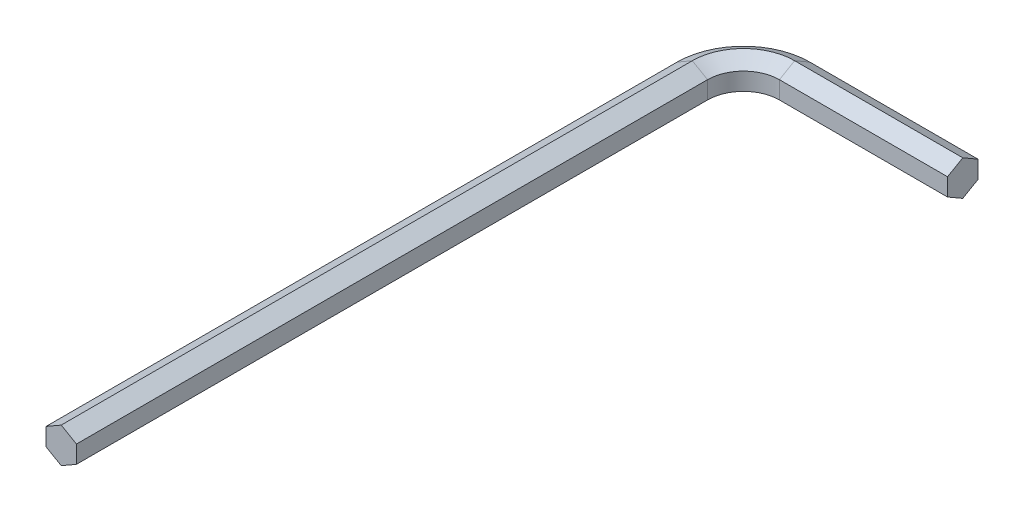
ISO-10303-21;
HEADER;
FILE_DESCRIPTION(('STEP AP214'),'2;1');
FILE_NAME('part.step','',(''),(''),'','','');
FILE_SCHEMA(('AUTOMOTIVE_DESIGN { 1 0 10303 214 1 1 1 1 }'));
ENDSEC;
DATA;
#1=APPLICATION_CONTEXT('core data for automotive mechanical design processes');
#2=APPLICATION_PROTOCOL_DEFINITION('international standard','automotive_design',2000,#1);
#3=PRODUCT_CONTEXT('',#1,'mechanical');
#4=PRODUCT('Part','Part','',(#3));
#5=PRODUCT_RELATED_PRODUCT_CATEGORY('part','',(#4));
#6=PRODUCT_DEFINITION_FORMATION('','',#4);
#7=PRODUCT_DEFINITION_CONTEXT('part definition',#1,'design');
#8=PRODUCT_DEFINITION('design','',#6,#7);
#9=PRODUCT_DEFINITION_SHAPE('','',#8);
#10=(LENGTH_UNIT() NAMED_UNIT(*) SI_UNIT(.MILLI.,.METRE.));
#11=(NAMED_UNIT(*) PLANE_ANGLE_UNIT() SI_UNIT($,.RADIAN.));
#12=(NAMED_UNIT(*) SI_UNIT($,.STERADIAN.) SOLID_ANGLE_UNIT());
#13=UNCERTAINTY_MEASURE_WITH_UNIT(LENGTH_MEASURE(1.E-05),#10,'distance_accuracy_value','');
#14=(GEOMETRIC_REPRESENTATION_CONTEXT(3) GLOBAL_UNCERTAINTY_ASSIGNED_CONTEXT((#13)) GLOBAL_UNIT_ASSIGNED_CONTEXT((#10,
#11,#12)) REPRESENTATION_CONTEXT('',''));
#15=CARTESIAN_POINT('',(0.,0.,0.));
#16=DIRECTION('',(0.,0.,1.));
#17=DIRECTION('',(1.,0.,0.));
#18=AXIS2_PLACEMENT_3D('',#15,#16,#17);
#19=CARTESIAN_POINT('',(0.,0.,0.));
#20=DIRECTION('',(0.,0.,1.));
#21=DIRECTION('',(1.,0.,0.));
#22=AXIS2_PLACEMENT_3D('',#19,#20,#21);
#23=PLANE('',#22);
#24=DIRECTION('',(0.866025403784441,-0.499999999999995,0.));
#25=VECTOR('',#24,1.);
#26=CARTESIAN_POINT('',(-1.24999999999999,-0.721687836487043,0.));
#27=LINE('',#26,#25);
#28=CARTESIAN_POINT('',(-1.24999999999999,-0.721687836487043,0.));
#29=VERTEX_POINT('',#28);
#30=CARTESIAN_POINT('',(0.,-1.44337567297406,0.));
#31=VERTEX_POINT('',#30);
#32=EDGE_CURVE('E188',#29,#31,#27,.T.);
#33=ORIENTED_EDGE('',*,*,#32,.T.);
#34=DIRECTION('',(0.866025403784438,0.500000000000001,0.));
#35=VECTOR('',#34,1.);
#36=CARTESIAN_POINT('',(0.,-1.44337567297406,0.));
#37=LINE('',#36,#35);
#38=CARTESIAN_POINT('',(1.25,-0.721687836487026,0.));
#39=VERTEX_POINT('',#38);
#40=EDGE_CURVE('E147',#31,#39,#37,.T.);
#41=ORIENTED_EDGE('',*,*,#40,.T.);
#42=DIRECTION('',(0.,1.,0.));
#43=VECTOR('',#42,1.);
#44=CARTESIAN_POINT('',(1.25,-0.721687836487026,0.));
#45=LINE('',#44,#43);
#46=CARTESIAN_POINT('',(1.24999999999999,0.721687836487034,0.));
#47=VERTEX_POINT('',#46);
#48=EDGE_CURVE('E139',#39,#47,#45,.T.);
#49=ORIENTED_EDGE('',*,*,#48,.T.);
#50=DIRECTION('',(-0.866025403784441,0.499999999999995,0.));
#51=VECTOR('',#50,1.);
#52=CARTESIAN_POINT('',(1.24999999999999,0.721687836487034,0.));
#53=LINE('',#52,#51);
#54=CARTESIAN_POINT('',(0.,1.44337567297406,0.));
#55=VERTEX_POINT('',#54);
#56=EDGE_CURVE('E132',#47,#55,#53,.T.);
#57=ORIENTED_EDGE('',*,*,#56,.T.);
#58=DIRECTION('',(-0.866025403784435,-0.500000000000007,0.));
#59=VECTOR('',#58,1.);
#60=CARTESIAN_POINT('',(0.,1.44337567297406,0.));
#61=LINE('',#60,#59);
#62=CARTESIAN_POINT('',(-1.25,0.721687836487017,0.));
#63=VERTEX_POINT('',#62);
#64=EDGE_CURVE('E213',#55,#63,#61,.T.);
#65=ORIENTED_EDGE('',*,*,#64,.T.);
#66=DIRECTION('',(0.,-1.,0.));
#67=VECTOR('',#66,1.);
#68=CARTESIAN_POINT('',(-1.25,0.721687836487017,0.));
#69=LINE('',#68,#67);
#70=EDGE_CURVE('E227',#63,#29,#69,.T.);
#71=ORIENTED_EDGE('',*,*,#70,.T.);
#72=EDGE_LOOP('',(#33,#41,#49,#57,#65,#71));
#73=FACE_BOUND('',#72,.T.);
#74=ADVANCED_FACE('F33',(#73),#23,.T.);
#75=CARTESIAN_POINT('',(18.,0.,-56.));
#76=DIRECTION('',(-1.,0.,0.));
#77=DIRECTION('',(0.,0.,1.));
#78=AXIS2_PLACEMENT_3D('',#75,#76,#77);
#79=PLANE('',#78);
#80=DIRECTION('',(0.,-0.499999999999995,0.866025403784441));
#81=VECTOR('',#80,1.);
#82=CARTESIAN_POINT('',(18.,-0.721687836487043,-57.25));
#83=LINE('',#82,#81);
#84=CARTESIAN_POINT('',(18.,-0.721687836487043,-57.25));
#85=VERTEX_POINT('',#84);
#86=CARTESIAN_POINT('',(18.,-1.44337567297406,-56.));
#87=VERTEX_POINT('',#86);
#88=EDGE_CURVE('E161',#85,#87,#83,.T.);
#89=ORIENTED_EDGE('',*,*,#88,.F.);
#90=DIRECTION('',(0.,-1.,0.));
#91=VECTOR('',#90,1.);
#92=CARTESIAN_POINT('',(18.,0.721687836487017,-57.25));
#93=LINE('',#92,#91);
#94=CARTESIAN_POINT('',(18.,0.721687836487017,-57.25));
#95=VERTEX_POINT('',#94);
#96=EDGE_CURVE('E11',#95,#85,#93,.T.);
#97=ORIENTED_EDGE('',*,*,#96,.F.);
#98=DIRECTION('',(0.,-0.500000000000007,-0.866025403784435));
#99=VECTOR('',#98,1.);
#100=CARTESIAN_POINT('',(18.,1.44337567297406,-56.));
#101=LINE('',#100,#99);
#102=CARTESIAN_POINT('',(18.,1.44337567297406,-56.));
#103=VERTEX_POINT('',#102);
#104=EDGE_CURVE('E47',#103,#95,#101,.T.);
#105=ORIENTED_EDGE('',*,*,#104,.F.);
#106=DIRECTION('',(0.,0.499999999999995,-0.866025403784441));
#107=VECTOR('',#106,1.);
#108=CARTESIAN_POINT('',(18.,0.721687836487034,-54.75));
#109=LINE('',#108,#107);
#110=CARTESIAN_POINT('',(18.,0.721687836487034,-54.75));
#111=VERTEX_POINT('',#110);
#112=EDGE_CURVE('E56',#111,#103,#109,.T.);
#113=ORIENTED_EDGE('',*,*,#112,.F.);
#114=DIRECTION('',(0.,1.,0.));
#115=VECTOR('',#114,1.);
#116=CARTESIAN_POINT('',(18.,-0.721687836487026,-54.75));
#117=LINE('',#116,#115);
#118=CARTESIAN_POINT('',(18.,-0.721687836487026,-54.75));
#119=VERTEX_POINT('',#118);
#120=EDGE_CURVE('E174',#119,#111,#117,.T.);
#121=ORIENTED_EDGE('',*,*,#120,.F.);
#122=DIRECTION('',(0.,0.500000000000001,0.866025403784438));
#123=VECTOR('',#122,1.);
#124=CARTESIAN_POINT('',(18.,-1.44337567297406,-56.));
#125=LINE('',#124,#123);
#126=EDGE_CURVE('E172',#87,#119,#125,.T.);
#127=ORIENTED_EDGE('',*,*,#126,.F.);
#128=EDGE_LOOP('',(#89,#97,#105,#113,#121,#127));
#129=FACE_BOUND('',#128,.T.);
#130=ADVANCED_FACE('F173',(#129),#79,.F.);
#131=CARTESIAN_POINT('',(-1.24999999999999,-0.721687836487043,0.));
#132=DIRECTION('',(0.499999999999995,0.866025403784441,0.));
#133=DIRECTION('',(-0.866025403784441,0.499999999999995,0.));
#134=AXIS2_PLACEMENT_3D('',#131,#132,#133);
#135=PLANE('',#134);
#136=DIRECTION('',(0.,0.,-1.));
#137=VECTOR('',#136,1.);
#138=CARTESIAN_POINT('',(0.,-1.44337567297406,0.));
#139=LINE('',#138,#137);
#140=CARTESIAN_POINT('',(0.,-1.44337567297406,-51.8));
#141=VERTEX_POINT('',#140);
#142=EDGE_CURVE('E193',#31,#141,#139,.T.);
#143=ORIENTED_EDGE('',*,*,#142,.F.);
#144=ORIENTED_EDGE('',*,*,#32,.F.);
#145=DIRECTION('',(0.,0.,-1.));
#146=VECTOR('',#145,1.);
#147=CARTESIAN_POINT('',(-1.24999999999999,-0.721687836487043,0.));
#148=LINE('',#147,#146);
#149=CARTESIAN_POINT('',(-1.24999999999999,-0.721687836487043,-51.8));
#150=VERTEX_POINT('',#149);
#151=EDGE_CURVE('E243',#29,#150,#148,.T.);
#152=ORIENTED_EDGE('',*,*,#151,.T.);
#153=DIRECTION('',(0.866025403784441,-0.499999999999995,0.));
#154=VECTOR('',#153,1.);
#155=CARTESIAN_POINT('',(-1.24999999999999,-0.721687836487043,-51.8));
#156=LINE('',#155,#154);
#157=EDGE_CURVE('E259',#150,#141,#156,.T.);
#158=ORIENTED_EDGE('',*,*,#157,.T.);
#159=EDGE_LOOP('',(#143,#144,#152,#158));
#160=FACE_BOUND('',#159,.T.);
#161=ADVANCED_FACE('F270',(#160),#135,.F.);
#162=CARTESIAN_POINT('',(0.,-1.44337567297406,0.));
#163=DIRECTION('',(-0.500000000000001,0.866025403784438,0.));
#164=DIRECTION('',(-0.866025403784438,-0.500000000000001,0.));
#165=AXIS2_PLACEMENT_3D('',#162,#163,#164);
#166=PLANE('',#165);
#167=DIRECTION('',(0.,0.,-1.));
#168=VECTOR('',#167,1.);
#169=CARTESIAN_POINT('',(1.25,-0.721687836487026,0.));
#170=LINE('',#169,#168);
#171=CARTESIAN_POINT('',(1.25,-0.721687836487026,-51.8));
#172=VERTEX_POINT('',#171);
#173=EDGE_CURVE('E192',#39,#172,#170,.T.);
#174=ORIENTED_EDGE('',*,*,#173,.F.);
#175=ORIENTED_EDGE('',*,*,#40,.F.);
#176=ORIENTED_EDGE('',*,*,#142,.T.);
#177=DIRECTION('',(0.866025403784438,0.500000000000001,0.));
#178=VECTOR('',#177,1.);
#179=CARTESIAN_POINT('',(0.,-1.44337567297406,-51.8));
#180=LINE('',#179,#178);
#181=EDGE_CURVE('E189',#141,#172,#180,.T.);
#182=ORIENTED_EDGE('',*,*,#181,.T.);
#183=EDGE_LOOP('',(#174,#175,#176,#182));
#184=FACE_BOUND('',#183,.T.);
#185=ADVANCED_FACE('F271',(#184),#166,.F.);
#186=CARTESIAN_POINT('',(1.25,-0.721687836487026,0.));
#187=DIRECTION('',(-1.,0.,0.));
#188=DIRECTION('',(0.,-1.,0.));
#189=AXIS2_PLACEMENT_3D('',#186,#187,#188);
#190=PLANE('',#189);
#191=DIRECTION('',(0.,0.,-1.));
#192=VECTOR('',#191,1.);
#193=CARTESIAN_POINT('',(1.24999999999999,0.721687836487034,0.));
#194=LINE('',#193,#192);
#195=CARTESIAN_POINT('',(1.24999999999999,0.721687836487034,-51.8));
#196=VERTEX_POINT('',#195);
#197=EDGE_CURVE('E204',#47,#196,#194,.T.);
#198=ORIENTED_EDGE('',*,*,#197,.F.);
#199=ORIENTED_EDGE('',*,*,#48,.F.);
#200=ORIENTED_EDGE('',*,*,#173,.T.);
#201=DIRECTION('',(0.,1.,0.));
#202=VECTOR('',#201,1.);
#203=CARTESIAN_POINT('',(1.25,-0.721687836487026,-51.8));
#204=LINE('',#203,#202);
#205=EDGE_CURVE('E195',#172,#196,#204,.T.);
#206=ORIENTED_EDGE('',*,*,#205,.T.);
#207=EDGE_LOOP('',(#198,#199,#200,#206));
#208=FACE_BOUND('',#207,.T.);
#209=ADVANCED_FACE('F324',(#208),#190,.F.);
#210=CARTESIAN_POINT('',(1.24999999999999,0.721687836487034,0.));
#211=DIRECTION('',(-0.499999999999995,-0.866025403784441,0.));
#212=DIRECTION('',(0.866025403784441,-0.499999999999995,0.));
#213=AXIS2_PLACEMENT_3D('',#210,#211,#212);
#214=PLANE('',#213);
#215=DIRECTION('',(0.,0.,-1.));
#216=VECTOR('',#215,1.);
#217=CARTESIAN_POINT('',(0.,1.44337567297406,0.));
#218=LINE('',#217,#216);
#219=CARTESIAN_POINT('',(0.,1.44337567297406,-51.8));
#220=VERTEX_POINT('',#219);
#221=EDGE_CURVE('E216',#55,#220,#218,.T.);
#222=ORIENTED_EDGE('',*,*,#221,.F.);
#223=ORIENTED_EDGE('',*,*,#56,.F.);
#224=ORIENTED_EDGE('',*,*,#197,.T.);
#225=DIRECTION('',(-0.866025403784441,0.499999999999995,0.));
#226=VECTOR('',#225,1.);
#227=CARTESIAN_POINT('',(1.24999999999999,0.721687836487034,-51.8));
#228=LINE('',#227,#226);
#229=EDGE_CURVE('E206',#196,#220,#228,.T.);
#230=ORIENTED_EDGE('',*,*,#229,.T.);
#231=EDGE_LOOP('',(#222,#223,#224,#230));
#232=FACE_BOUND('',#231,.T.);
#233=ADVANCED_FACE('F332',(#232),#214,.F.);
#234=CARTESIAN_POINT('',(0.,1.44337567297406,0.));
#235=DIRECTION('',(0.500000000000007,-0.866025403784434,0.));
#236=DIRECTION('',(0.866025403784435,0.500000000000007,0.));
#237=AXIS2_PLACEMENT_3D('',#234,#235,#236);
#238=PLANE('',#237);
#239=DIRECTION('',(0.,0.,-1.));
#240=VECTOR('',#239,1.);
#241=CARTESIAN_POINT('',(-1.25,0.721687836487017,0.));
#242=LINE('',#241,#240);
#243=CARTESIAN_POINT('',(-1.25,0.721687836487017,-51.8));
#244=VERTEX_POINT('',#243);
#245=EDGE_CURVE('E230',#63,#244,#242,.T.);
#246=ORIENTED_EDGE('',*,*,#245,.F.);
#247=ORIENTED_EDGE('',*,*,#64,.F.);
#248=ORIENTED_EDGE('',*,*,#221,.T.);
#249=DIRECTION('',(-0.866025403784435,-0.500000000000007,0.));
#250=VECTOR('',#249,1.);
#251=CARTESIAN_POINT('',(0.,1.44337567297406,-51.8));
#252=LINE('',#251,#250);
#253=EDGE_CURVE('E219',#220,#244,#252,.T.);
#254=ORIENTED_EDGE('',*,*,#253,.T.);
#255=EDGE_LOOP('',(#246,#247,#248,#254));
#256=FACE_BOUND('',#255,.T.);
#257=ADVANCED_FACE('F341',(#256),#238,.F.);
#258=CARTESIAN_POINT('',(-1.25,0.721687836487017,0.));
#259=DIRECTION('',(1.,0.,0.));
#260=DIRECTION('',(0.,1.,0.));
#261=AXIS2_PLACEMENT_3D('',#258,#259,#260);
#262=PLANE('',#261);
#263=DIRECTION('',(0.,-1.,0.));
#264=VECTOR('',#263,1.);
#265=CARTESIAN_POINT('',(-1.25,0.721687836487017,-51.8));
#266=LINE('',#265,#264);
#267=EDGE_CURVE('E233',#244,#150,#266,.T.);
#268=ORIENTED_EDGE('',*,*,#267,.T.);
#269=ORIENTED_EDGE('',*,*,#151,.F.);
#270=ORIENTED_EDGE('',*,*,#70,.F.);
#271=ORIENTED_EDGE('',*,*,#245,.T.);
#272=EDGE_LOOP('',(#268,#269,#270,#271));
#273=FACE_BOUND('',#272,.T.);
#274=ADVANCED_FACE('F282',(#273),#262,.F.);
#275=CARTESIAN_POINT('',(4.2,-0.721687836487043,-51.8));
#276=DIRECTION('',(0.,1.,0.));
#277=DIRECTION('',(0.,0.,1.));
#278=AXIS2_PLACEMENT_3D('',#275,#276,#277);
#279=CONICAL_SURFACE('',#278,5.44999999999999,1.0471975511966);
#280=CARTESIAN_POINT('',(4.2,-1.44337567297406,-51.8));
#281=DIRECTION('',(0.,-1.,0.));
#282=DIRECTION('',(-1.,0.,0.));
#283=AXIS2_PLACEMENT_3D('',#280,#281,#282);
#284=CIRCLE('',#283,4.2);
#285=CARTESIAN_POINT('',(4.2,-1.44337567297406,-56.));
#286=VERTEX_POINT('',#285);
#287=EDGE_CURVE('E197',#141,#286,#284,.T.);
#288=ORIENTED_EDGE('',*,*,#287,.F.);
#289=ORIENTED_EDGE('',*,*,#157,.F.);
#290=CARTESIAN_POINT('',(4.2,-0.721687836487043,-51.8));
#291=DIRECTION('',(0.,-1.,0.));
#292=DIRECTION('',(-1.,0.,0.));
#293=AXIS2_PLACEMENT_3D('',#290,#291,#292);
#294=CIRCLE('',#293,5.44999999999999);
#295=CARTESIAN_POINT('',(4.2,-0.721687836487043,-57.25));
#296=VERTEX_POINT('',#295);
#297=EDGE_CURVE('E245',#150,#296,#294,.T.);
#298=ORIENTED_EDGE('',*,*,#297,.T.);
#299=DIRECTION('',(0.,-0.499999999999995,0.866025403784441));
#300=VECTOR('',#299,1.);
#301=CARTESIAN_POINT('',(4.2,-0.721687836487043,-57.25));
#302=LINE('',#301,#300);
#303=EDGE_CURVE('E253',#296,#286,#302,.T.);
#304=ORIENTED_EDGE('',*,*,#303,.T.);
#305=EDGE_LOOP('',(#288,#289,#298,#304));
#306=FACE_BOUND('',#305,.T.);
#307=ADVANCED_FACE('F257',(#306),#279,.T.);
#308=CARTESIAN_POINT('',(4.2,-1.44337567297406,-51.8));
#309=DIRECTION('',(0.,-1.,0.));
#310=DIRECTION('',(0.,0.,-1.));
#311=AXIS2_PLACEMENT_3D('',#308,#309,#310);
#312=CONICAL_SURFACE('',#311,4.2,1.0471975511966);
#313=CARTESIAN_POINT('',(4.2,-0.721687836487026,-51.8));
#314=DIRECTION('',(0.,-1.,0.));
#315=DIRECTION('',(-1.,0.,0.));
#316=AXIS2_PLACEMENT_3D('',#313,#314,#315);
#317=CIRCLE('',#316,2.95000000000001);
#318=CARTESIAN_POINT('',(4.2,-0.721687836487026,-54.75));
#319=VERTEX_POINT('',#318);
#320=EDGE_CURVE('E119',#172,#319,#317,.T.);
#321=ORIENTED_EDGE('',*,*,#320,.F.);
#322=ORIENTED_EDGE('',*,*,#181,.F.);
#323=ORIENTED_EDGE('',*,*,#287,.T.);
#324=DIRECTION('',(0.,0.500000000000001,0.866025403784438));
#325=VECTOR('',#324,1.);
#326=CARTESIAN_POINT('',(4.2,-1.44337567297406,-56.));
#327=LINE('',#326,#325);
#328=EDGE_CURVE('E180',#286,#319,#327,.T.);
#329=ORIENTED_EDGE('',*,*,#328,.T.);
#330=EDGE_LOOP('',(#321,#322,#323,#329));
#331=FACE_BOUND('',#330,.T.);
#332=ADVANCED_FACE('F272',(#331),#312,.F.);
#333=CARTESIAN_POINT('',(4.2,0.,-51.8));
#334=DIRECTION('',(0.,-1.,0.));
#335=DIRECTION('',(0.,0.,-1.));
#336=AXIS2_PLACEMENT_3D('',#333,#334,#335);
#337=CYLINDRICAL_SURFACE('',#336,2.95000000000001);
#338=CARTESIAN_POINT('',(4.2,0.721687836487034,-51.8));
#339=DIRECTION('',(0.,-1.,0.));
#340=DIRECTION('',(-1.,0.,0.));
#341=AXIS2_PLACEMENT_3D('',#338,#339,#340);
#342=CIRCLE('',#341,2.95000000000001);
#343=CARTESIAN_POINT('',(4.2,0.721687836487034,-54.75));
#344=VERTEX_POINT('',#343);
#345=EDGE_CURVE('E111',#196,#344,#342,.T.);
#346=ORIENTED_EDGE('',*,*,#345,.F.);
#347=ORIENTED_EDGE('',*,*,#205,.F.);
#348=ORIENTED_EDGE('',*,*,#320,.T.);
#349=DIRECTION('',(0.,1.,0.));
#350=VECTOR('',#349,1.);
#351=CARTESIAN_POINT('',(4.2,-0.721687836487026,-54.75));
#352=LINE('',#351,#350);
#353=EDGE_CURVE('E198',#319,#344,#352,.T.);
#354=ORIENTED_EDGE('',*,*,#353,.T.);
#355=EDGE_LOOP('',(#346,#347,#348,#354));
#356=FACE_BOUND('',#355,.T.);
#357=ADVANCED_FACE('F274',(#356),#337,.F.);
#358=CARTESIAN_POINT('',(4.2,0.721687836487034,-51.8));
#359=DIRECTION('',(0.,1.,0.));
#360=DIRECTION('',(0.,0.,1.));
#361=AXIS2_PLACEMENT_3D('',#358,#359,#360);
#362=CONICAL_SURFACE('',#361,2.95000000000001,1.0471975511966);
#363=CARTESIAN_POINT('',(4.2,1.44337567297406,-51.8));
#364=DIRECTION('',(0.,-1.,0.));
#365=DIRECTION('',(-1.,0.,0.));
#366=AXIS2_PLACEMENT_3D('',#363,#364,#365);
#367=CIRCLE('',#366,4.20000000000001);
#368=CARTESIAN_POINT('',(4.2,1.44337567297406,-56.));
#369=VERTEX_POINT('',#368);
#370=EDGE_CURVE('E103',#220,#369,#367,.T.);
#371=ORIENTED_EDGE('',*,*,#370,.F.);
#372=ORIENTED_EDGE('',*,*,#229,.F.);
#373=ORIENTED_EDGE('',*,*,#345,.T.);
#374=DIRECTION('',(0.,0.499999999999995,-0.866025403784441));
#375=VECTOR('',#374,1.);
#376=CARTESIAN_POINT('',(4.2,0.721687836487034,-54.75));
#377=LINE('',#376,#375);
#378=EDGE_CURVE('E209',#344,#369,#377,.T.);
#379=ORIENTED_EDGE('',*,*,#378,.T.);
#380=EDGE_LOOP('',(#371,#372,#373,#379));
#381=FACE_BOUND('',#380,.T.);
#382=ADVANCED_FACE('F280',(#381),#362,.F.);
#383=CARTESIAN_POINT('',(4.2,1.44337567297406,-51.8));
#384=DIRECTION('',(0.,-1.,0.));
#385=DIRECTION('',(0.,0.,-1.));
#386=AXIS2_PLACEMENT_3D('',#383,#384,#385);
#387=CONICAL_SURFACE('',#386,4.20000000000001,1.04719755119659);
#388=CARTESIAN_POINT('',(4.2,0.721687836487017,-51.8));
#389=DIRECTION('',(0.,-1.,0.));
#390=DIRECTION('',(-1.,0.,0.));
#391=AXIS2_PLACEMENT_3D('',#388,#389,#390);
#392=CIRCLE('',#391,5.45);
#393=CARTESIAN_POINT('',(4.2,0.721687836487017,-57.25));
#394=VERTEX_POINT('',#393);
#395=EDGE_CURVE('E236',#244,#394,#392,.T.);
#396=ORIENTED_EDGE('',*,*,#395,.F.);
#397=ORIENTED_EDGE('',*,*,#253,.F.);
#398=ORIENTED_EDGE('',*,*,#370,.T.);
#399=DIRECTION('',(0.,-0.500000000000007,-0.866025403784435));
#400=VECTOR('',#399,1.);
#401=CARTESIAN_POINT('',(4.2,1.44337567297406,-56.));
#402=LINE('',#401,#400);
#403=EDGE_CURVE('E222',#369,#394,#402,.T.);
#404=ORIENTED_EDGE('',*,*,#403,.T.);
#405=EDGE_LOOP('',(#396,#397,#398,#404));
#406=FACE_BOUND('',#405,.T.);
#407=ADVANCED_FACE('F383',(#406),#387,.T.);
#408=CARTESIAN_POINT('',(4.2,0.,-51.8));
#409=DIRECTION('',(0.,-1.,0.));
#410=DIRECTION('',(0.,0.,-1.));
#411=AXIS2_PLACEMENT_3D('',#408,#409,#410);
#412=CYLINDRICAL_SURFACE('',#411,5.44999999999999);
#413=DIRECTION('',(0.,-1.,0.));
#414=VECTOR('',#413,1.);
#415=CARTESIAN_POINT('',(4.2,0.721687836487017,-57.25));
#416=LINE('',#415,#414);
#417=EDGE_CURVE('E186',#394,#296,#416,.T.);
#418=ORIENTED_EDGE('',*,*,#417,.T.);
#419=ORIENTED_EDGE('',*,*,#297,.F.);
#420=ORIENTED_EDGE('',*,*,#267,.F.);
#421=ORIENTED_EDGE('',*,*,#395,.T.);
#422=EDGE_LOOP('',(#418,#419,#420,#421));
#423=FACE_BOUND('',#422,.T.);
#424=ADVANCED_FACE('F248',(#423),#412,.T.);
#425=CARTESIAN_POINT('',(4.2,-0.721687836487043,-57.25));
#426=DIRECTION('',(0.,0.866025403784441,0.499999999999995));
#427=DIRECTION('',(0.,-0.499999999999995,0.866025403784442));
#428=AXIS2_PLACEMENT_3D('',#425,#426,#427);
#429=PLANE('',#428);
#430=DIRECTION('',(1.,0.,0.));
#431=VECTOR('',#430,1.);
#432=CARTESIAN_POINT('',(4.2,-1.44337567297406,-56.));
#433=LINE('',#432,#431);
#434=EDGE_CURVE('E166',#286,#87,#433,.T.);
#435=ORIENTED_EDGE('',*,*,#434,.F.);
#436=ORIENTED_EDGE('',*,*,#303,.F.);
#437=DIRECTION('',(1.,0.,0.));
#438=VECTOR('',#437,1.);
#439=CARTESIAN_POINT('',(4.2,-0.721687836487043,-57.25));
#440=LINE('',#439,#438);
#441=EDGE_CURVE('E168',#296,#85,#440,.T.);
#442=ORIENTED_EDGE('',*,*,#441,.T.);
#443=ORIENTED_EDGE('',*,*,#88,.T.);
#444=EDGE_LOOP('',(#435,#436,#442,#443));
#445=FACE_BOUND('',#444,.T.);
#446=ADVANCED_FACE('F163',(#445),#429,.F.);
#447=CARTESIAN_POINT('',(4.2,-1.44337567297406,-56.));
#448=DIRECTION('',(0.,0.866025403784438,-0.500000000000001));
#449=DIRECTION('',(0.,0.500000000000001,0.866025403784438));
#450=AXIS2_PLACEMENT_3D('',#447,#448,#449);
#451=PLANE('',#450);
#452=DIRECTION('',(1.,0.,0.));
#453=VECTOR('',#452,1.);
#454=CARTESIAN_POINT('',(4.2,-0.721687836487026,-54.75));
#455=LINE('',#454,#453);
#456=EDGE_CURVE('E177',#319,#119,#455,.T.);
#457=ORIENTED_EDGE('',*,*,#456,.F.);
#458=ORIENTED_EDGE('',*,*,#328,.F.);
#459=ORIENTED_EDGE('',*,*,#434,.T.);
#460=ORIENTED_EDGE('',*,*,#126,.T.);
#461=EDGE_LOOP('',(#457,#458,#459,#460));
#462=FACE_BOUND('',#461,.T.);
#463=ADVANCED_FACE('F179',(#462),#451,.F.);
#464=CARTESIAN_POINT('',(4.2,-0.721687836487026,-54.75));
#465=DIRECTION('',(0.,0.,-1.));
#466=DIRECTION('',(0.,1.,0.));
#467=AXIS2_PLACEMENT_3D('',#464,#465,#466);
#468=PLANE('',#467);
#469=DIRECTION('',(1.,0.,0.));
#470=VECTOR('',#469,1.);
#471=CARTESIAN_POINT('',(4.2,0.721687836487034,-54.75));
#472=LINE('',#471,#470);
#473=EDGE_CURVE('E88',#344,#111,#472,.T.);
#474=ORIENTED_EDGE('',*,*,#473,.F.);
#475=ORIENTED_EDGE('',*,*,#353,.F.);
#476=ORIENTED_EDGE('',*,*,#456,.T.);
#477=ORIENTED_EDGE('',*,*,#120,.T.);
#478=EDGE_LOOP('',(#474,#475,#476,#477));
#479=FACE_BOUND('',#478,.T.);
#480=ADVANCED_FACE('F416',(#479),#468,.F.);
#481=CARTESIAN_POINT('',(4.2,0.721687836487034,-54.75));
#482=DIRECTION('',(0.,-0.866025403784441,-0.499999999999995));
#483=DIRECTION('',(0.,0.499999999999995,-0.866025403784442));
#484=AXIS2_PLACEMENT_3D('',#481,#482,#483);
#485=PLANE('',#484);
#486=DIRECTION('',(1.,0.,0.));
#487=VECTOR('',#486,1.);
#488=CARTESIAN_POINT('',(4.2,1.44337567297406,-56.));
#489=LINE('',#488,#487);
#490=EDGE_CURVE('E82',#369,#103,#489,.T.);
#491=ORIENTED_EDGE('',*,*,#490,.F.);
#492=ORIENTED_EDGE('',*,*,#378,.F.);
#493=ORIENTED_EDGE('',*,*,#473,.T.);
#494=ORIENTED_EDGE('',*,*,#112,.T.);
#495=EDGE_LOOP('',(#491,#492,#493,#494));
#496=FACE_BOUND('',#495,.T.);
#497=ADVANCED_FACE('F293',(#496),#485,.F.);
#498=CARTESIAN_POINT('',(4.2,1.44337567297406,-56.));
#499=DIRECTION('',(0.,-0.866025403784435,0.500000000000007));
#500=DIRECTION('',(0.,-0.500000000000007,-0.866025403784435));
#501=AXIS2_PLACEMENT_3D('',#498,#499,#500);
#502=PLANE('',#501);
#503=DIRECTION('',(1.,0.,0.));
#504=VECTOR('',#503,1.);
#505=CARTESIAN_POINT('',(4.2,0.721687836487017,-57.25));
#506=LINE('',#505,#504);
#507=EDGE_CURVE('E40',#394,#95,#506,.T.);
#508=ORIENTED_EDGE('',*,*,#507,.F.);
#509=ORIENTED_EDGE('',*,*,#403,.F.);
#510=ORIENTED_EDGE('',*,*,#490,.T.);
#511=ORIENTED_EDGE('',*,*,#104,.T.);
#512=EDGE_LOOP('',(#508,#509,#510,#511));
#513=FACE_BOUND('',#512,.T.);
#514=ADVANCED_FACE('F288',(#513),#502,.F.);
#515=CARTESIAN_POINT('',(4.2,0.721687836487017,-57.25));
#516=DIRECTION('',(0.,0.,1.));
#517=DIRECTION('',(0.,-1.,0.));
#518=AXIS2_PLACEMENT_3D('',#515,#516,#517);
#519=PLANE('',#518);
#520=ORIENTED_EDGE('',*,*,#96,.T.);
#521=ORIENTED_EDGE('',*,*,#441,.F.);
#522=ORIENTED_EDGE('',*,*,#417,.F.);
#523=ORIENTED_EDGE('',*,*,#507,.T.);
#524=EDGE_LOOP('',(#520,#521,#522,#523));
#525=FACE_BOUND('',#524,.T.);
#526=ADVANCED_FACE('F286',(#525),#519,.F.);
#527=CLOSED_SHELL('',(#74,#130,#161,#185,#209,#233,#257,#274,#307,#332,#357,#382,#407,#424,#446,
#463,#480,#497,#514,#526));
#528=MANIFOLD_SOLID_BREP('B2',#527);
#529=ADVANCED_BREP_SHAPE_REPRESENTATION('',(#18,#528),#14);
#530=SHAPE_DEFINITION_REPRESENTATION(#9,#529);
ENDSEC;
END-ISO-10303-21;
